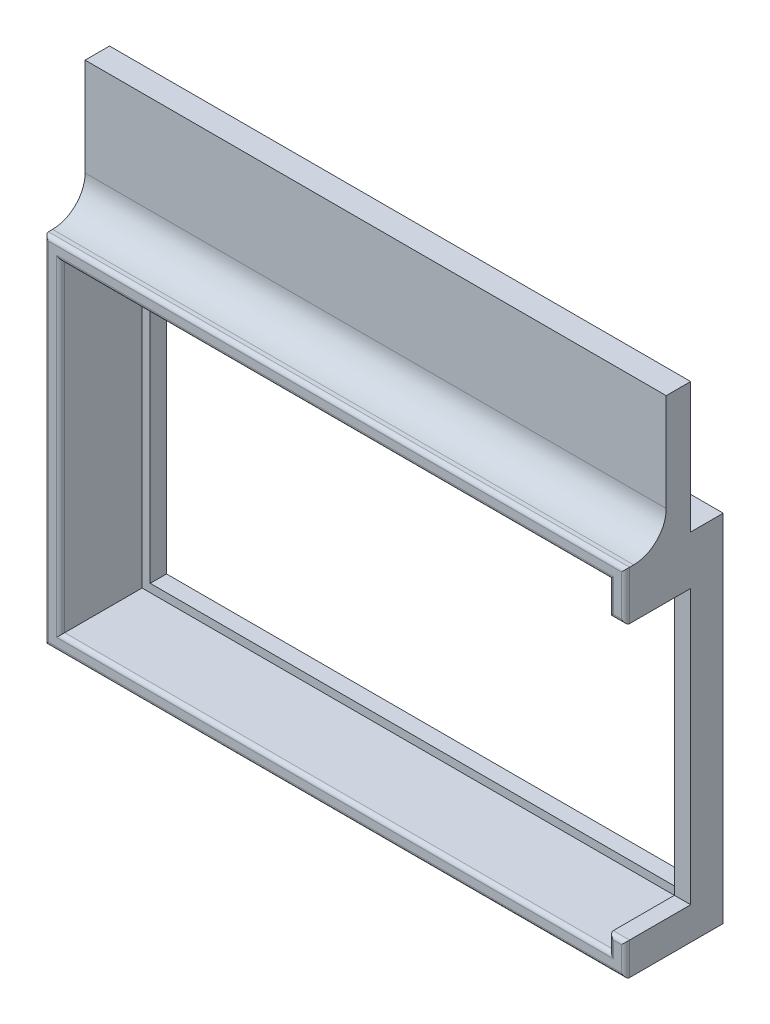
ISO-10303-21;
HEADER;
FILE_DESCRIPTION(('STEP AP214'),'2;1');
FILE_NAME('part.step','',(''),(''),'','','');
FILE_SCHEMA(('AUTOMOTIVE_DESIGN { 1 0 10303 214 1 1 1 1 }'));
ENDSEC;
DATA;
#1=APPLICATION_CONTEXT('core data for automotive mechanical design processes');
#2=APPLICATION_PROTOCOL_DEFINITION('international standard','automotive_design',2000,#1);
#3=PRODUCT_CONTEXT('',#1,'mechanical');
#4=PRODUCT('Part','Part','',(#3));
#5=PRODUCT_RELATED_PRODUCT_CATEGORY('part','',(#4));
#6=PRODUCT_DEFINITION_FORMATION('','',#4);
#7=PRODUCT_DEFINITION_CONTEXT('part definition',#1,'design');
#8=PRODUCT_DEFINITION('design','',#6,#7);
#9=PRODUCT_DEFINITION_SHAPE('','',#8);
#10=(LENGTH_UNIT() NAMED_UNIT(*) SI_UNIT(.MILLI.,.METRE.));
#11=(NAMED_UNIT(*) PLANE_ANGLE_UNIT() SI_UNIT($,.RADIAN.));
#12=(NAMED_UNIT(*) SI_UNIT($,.STERADIAN.) SOLID_ANGLE_UNIT());
#13=UNCERTAINTY_MEASURE_WITH_UNIT(LENGTH_MEASURE(1.E-05),#10,'distance_accuracy_value','');
#14=(GEOMETRIC_REPRESENTATION_CONTEXT(3) GLOBAL_UNCERTAINTY_ASSIGNED_CONTEXT((#13)) GLOBAL_UNIT_ASSIGNED_CONTEXT((#10,
#11,#12)) REPRESENTATION_CONTEXT('',''));
#15=CARTESIAN_POINT('',(0.,0.,0.));
#16=DIRECTION('',(0.,0.,1.));
#17=DIRECTION('',(1.,0.,0.));
#18=AXIS2_PLACEMENT_3D('',#15,#16,#17);
#19=CARTESIAN_POINT('',(0.,29.82,2.));
#20=DIRECTION('',(0.,1.,0.));
#21=DIRECTION('',(0.,0.,1.));
#22=AXIS2_PLACEMENT_3D('',#19,#20,#21);
#23=PLANE('',#22);
#24=DIRECTION('',(0.,0.,1.));
#25=VECTOR('',#24,1.);
#26=CARTESIAN_POINT('',(0.,29.82,2.));
#27=LINE('',#26,#25);
#28=CARTESIAN_POINT('',(0.,29.82,2.));
#29=VERTEX_POINT('',#28);
#30=CARTESIAN_POINT('',(0.,29.82,3.5));
#31=VERTEX_POINT('',#30);
#32=EDGE_CURVE('E229',#29,#31,#27,.T.);
#33=ORIENTED_EDGE('',*,*,#32,.T.);
#34=DIRECTION('',(-1.,0.,0.));
#35=VECTOR('',#34,1.);
#36=CARTESIAN_POINT('',(0.,29.82,3.5));
#37=LINE('',#36,#35);
#38=CARTESIAN_POINT('',(35.68,29.82,3.5));
#39=VERTEX_POINT('',#38);
#40=EDGE_CURVE('E214',#39,#31,#37,.T.);
#41=ORIENTED_EDGE('',*,*,#40,.F.);
#42=DIRECTION('',(0.,0.,1.));
#43=VECTOR('',#42,1.);
#44=CARTESIAN_POINT('',(35.68,29.82,2.));
#45=LINE('',#44,#43);
#46=CARTESIAN_POINT('',(35.68,29.82,2.));
#47=VERTEX_POINT('',#46);
#48=EDGE_CURVE('E238',#47,#39,#45,.T.);
#49=ORIENTED_EDGE('',*,*,#48,.F.);
#50=DIRECTION('',(-1.,0.,0.));
#51=VECTOR('',#50,1.);
#52=CARTESIAN_POINT('',(0.,29.82,2.));
#53=LINE('',#52,#51);
#54=EDGE_CURVE('E236',#47,#29,#53,.T.);
#55=ORIENTED_EDGE('',*,*,#54,.T.);
#56=EDGE_LOOP('',(#33,#41,#49,#55));
#57=FACE_BOUND('',#56,.T.);
#58=ADVANCED_FACE('F33',(#57),#23,.T.);
#59=CARTESIAN_POINT('',(0.,0.,1.));
#60=DIRECTION('',(0.,0.,-1.));
#61=DIRECTION('',(-1.,0.,0.));
#62=AXIS2_PLACEMENT_3D('',#59,#60,#61);
#63=PLANE('',#62);
#64=DIRECTION('',(0.,-1.,0.));
#65=VECTOR('',#64,1.);
#66=CARTESIAN_POINT('',(1.,1.,1.));
#67=LINE('',#66,#65);
#68=CARTESIAN_POINT('',(1.,20.82,1.));
#69=VERTEX_POINT('',#68);
#70=CARTESIAN_POINT('',(1.,1.,1.));
#71=VERTEX_POINT('',#70);
#72=EDGE_CURVE('E282',#69,#71,#67,.T.);
#73=ORIENTED_EDGE('',*,*,#72,.T.);
#74=DIRECTION('',(1.,0.,0.));
#75=VECTOR('',#74,1.);
#76=CARTESIAN_POINT('',(1.,1.,1.));
#77=LINE('',#76,#75);
#78=CARTESIAN_POINT('',(34.68,1.,1.));
#79=VERTEX_POINT('',#78);
#80=EDGE_CURVE('E291',#71,#79,#77,.T.);
#81=ORIENTED_EDGE('',*,*,#80,.T.);
#82=DIRECTION('',(0.,1.,0.));
#83=VECTOR('',#82,1.);
#84=CARTESIAN_POINT('',(34.68,1.,1.));
#85=LINE('',#84,#83);
#86=CARTESIAN_POINT('',(34.68,20.82,1.));
#87=VERTEX_POINT('',#86);
#88=EDGE_CURVE('E294',#79,#87,#85,.T.);
#89=ORIENTED_EDGE('',*,*,#88,.T.);
#90=DIRECTION('',(-1.,0.,0.));
#91=VECTOR('',#90,1.);
#92=CARTESIAN_POINT('',(1.,20.82,1.));
#93=LINE('',#92,#91);
#94=EDGE_CURVE('E297',#87,#69,#93,.T.);
#95=ORIENTED_EDGE('',*,*,#94,.T.);
#96=EDGE_LOOP('',(#73,#81,#89,#95));
#97=FACE_BOUND('',#96,.T.);
#98=DIRECTION('',(0.,-1.,0.));
#99=VECTOR('',#98,1.);
#100=CARTESIAN_POINT('',(1.5,1.5,1.));
#101=LINE('',#100,#99);
#102=CARTESIAN_POINT('',(1.5,20.32,1.));
#103=VERTEX_POINT('',#102);
#104=CARTESIAN_POINT('',(1.5,1.5,1.));
#105=VERTEX_POINT('',#104);
#106=EDGE_CURVE('E254',#103,#105,#101,.T.);
#107=ORIENTED_EDGE('',*,*,#106,.F.);
#108=DIRECTION('',(-1.,0.,0.));
#109=VECTOR('',#108,1.);
#110=CARTESIAN_POINT('',(1.5,20.32,1.));
#111=LINE('',#110,#109);
#112=CARTESIAN_POINT('',(34.18,20.32,1.));
#113=VERTEX_POINT('',#112);
#114=EDGE_CURVE('E261',#113,#103,#111,.T.);
#115=ORIENTED_EDGE('',*,*,#114,.F.);
#116=DIRECTION('',(0.,1.,0.));
#117=VECTOR('',#116,1.);
#118=CARTESIAN_POINT('',(34.18,1.5,1.));
#119=LINE('',#118,#117);
#120=CARTESIAN_POINT('',(34.18,1.5,1.));
#121=VERTEX_POINT('',#120);
#122=EDGE_CURVE('E276',#121,#113,#119,.T.);
#123=ORIENTED_EDGE('',*,*,#122,.F.);
#124=DIRECTION('',(1.,0.,0.));
#125=VECTOR('',#124,1.);
#126=CARTESIAN_POINT('',(1.5,1.5,1.));
#127=LINE('',#126,#125);
#128=EDGE_CURVE('E273',#105,#121,#127,.T.);
#129=ORIENTED_EDGE('',*,*,#128,.F.);
#130=EDGE_LOOP('',(#107,#115,#123,#129));
#131=FACE_BOUND('',#130,.T.);
#132=ADVANCED_FACE('F521',(#97,#131),#63,.F.);
#133=CARTESIAN_POINT('',(0.,0.,6.));
#134=DIRECTION('',(1.,0.,0.));
#135=DIRECTION('',(0.,0.,-1.));
#136=AXIS2_PLACEMENT_3D('',#133,#134,#135);
#137=PLANE('',#136);
#138=DIRECTION('',(0.,0.,-1.));
#139=VECTOR('',#138,1.);
#140=CARTESIAN_POINT('',(0.,0.,6.));
#141=LINE('',#140,#139);
#142=CARTESIAN_POINT('',(0.,0.,5.75));
#143=VERTEX_POINT('',#142);
#144=CARTESIAN_POINT('',(0.,0.,0.));
#145=VERTEX_POINT('',#144);
#146=EDGE_CURVE('E330',#143,#145,#141,.T.);
#147=ORIENTED_EDGE('',*,*,#146,.F.);
#148=DIRECTION('',(0.,-1.,0.));
#149=VECTOR('',#148,1.);
#150=CARTESIAN_POINT('',(0.,0.,5.75));
#151=LINE('',#150,#149);
#152=CARTESIAN_POINT('',(0.,21.82,5.75));
#153=VERTEX_POINT('',#152);
#154=EDGE_CURVE('E42',#143,#153,#151,.F.);
#155=ORIENTED_EDGE('',*,*,#154,.T.);
#156=DIRECTION('',(0.,0.,1.));
#157=VECTOR('',#156,1.);
#158=CARTESIAN_POINT('',(0.,21.82,3.5));
#159=LINE('',#158,#157);
#160=CARTESIAN_POINT('',(0.,21.82,5.5));
#161=VERTEX_POINT('',#160);
#162=EDGE_CURVE('E225',#161,#153,#159,.T.);
#163=ORIENTED_EDGE('',*,*,#162,.F.);
#164=CARTESIAN_POINT('',(0.,23.82,5.5));
#165=DIRECTION('',(1.,0.,0.));
#166=DIRECTION('',(0.,0.,-1.));
#167=AXIS2_PLACEMENT_3D('',#164,#165,#166);
#168=CIRCLE('',#167,2.);
#169=CARTESIAN_POINT('',(0.,23.82,3.5));
#170=VERTEX_POINT('',#169);
#171=EDGE_CURVE('E232',#161,#170,#168,.T.);
#172=ORIENTED_EDGE('',*,*,#171,.T.);
#173=DIRECTION('',(0.,-1.,0.));
#174=VECTOR('',#173,1.);
#175=CARTESIAN_POINT('',(0.,29.82,3.5));
#176=LINE('',#175,#174);
#177=EDGE_CURVE('E218',#31,#170,#176,.T.);
#178=ORIENTED_EDGE('',*,*,#177,.F.);
#179=ORIENTED_EDGE('',*,*,#32,.F.);
#180=DIRECTION('',(0.,-1.,0.));
#181=VECTOR('',#180,1.);
#182=CARTESIAN_POINT('',(0.,21.82,2.));
#183=LINE('',#182,#181);
#184=CARTESIAN_POINT('',(0.,21.82,2.));
#185=VERTEX_POINT('',#184);
#186=EDGE_CURVE('E491',#29,#185,#183,.T.);
#187=ORIENTED_EDGE('',*,*,#186,.T.);
#188=DIRECTION('',(0.,0.,-1.));
#189=VECTOR('',#188,1.);
#190=CARTESIAN_POINT('',(0.,21.82,6.));
#191=LINE('',#190,#189);
#192=CARTESIAN_POINT('',(0.,21.82,0.));
#193=VERTEX_POINT('',#192);
#194=EDGE_CURVE('E324',#185,#193,#191,.T.);
#195=ORIENTED_EDGE('',*,*,#194,.T.);
#196=DIRECTION('',(0.,-1.,0.));
#197=VECTOR('',#196,1.);
#198=CARTESIAN_POINT('',(0.,0.,0.));
#199=LINE('',#198,#197);
#200=EDGE_CURVE('E304',#193,#145,#199,.T.);
#201=ORIENTED_EDGE('',*,*,#200,.T.);
#202=EDGE_LOOP('',(#147,#155,#163,#172,#178,#179,#187,#195,#201));
#203=FACE_BOUND('',#202,.T.);
#204=ADVANCED_FACE('F227',(#203),#137,.F.);
#205=CARTESIAN_POINT('',(0.,0.,6.));
#206=DIRECTION('',(0.,1.,0.));
#207=DIRECTION('',(0.,0.,1.));
#208=AXIS2_PLACEMENT_3D('',#205,#206,#207);
#209=PLANE('',#208);
#210=DIRECTION('',(0.,0.,-1.));
#211=VECTOR('',#210,1.);
#212=CARTESIAN_POINT('',(35.68,0.,6.));
#213=LINE('',#212,#211);
#214=CARTESIAN_POINT('',(35.68,0.,5.75));
#215=VERTEX_POINT('',#214);
#216=CARTESIAN_POINT('',(35.68,0.,0.));
#217=VERTEX_POINT('',#216);
#218=EDGE_CURVE('E328',#215,#217,#213,.T.);
#219=ORIENTED_EDGE('',*,*,#218,.F.);
#220=DIRECTION('',(1.,0.,0.));
#221=VECTOR('',#220,1.);
#222=CARTESIAN_POINT('',(0.,0.,5.75));
#223=LINE('',#222,#221);
#224=EDGE_CURVE('E57',#215,#143,#223,.F.);
#225=ORIENTED_EDGE('',*,*,#224,.T.);
#226=ORIENTED_EDGE('',*,*,#146,.T.);
#227=DIRECTION('',(1.,0.,0.));
#228=VECTOR('',#227,1.);
#229=CARTESIAN_POINT('',(0.,0.,0.));
#230=LINE('',#229,#228);
#231=EDGE_CURVE('E315',#145,#217,#230,.T.);
#232=ORIENTED_EDGE('',*,*,#231,.T.);
#233=EDGE_LOOP('',(#219,#225,#226,#232));
#234=FACE_BOUND('',#233,.T.);
#235=ADVANCED_FACE('F513',(#234),#209,.F.);
#236=CARTESIAN_POINT('',(35.68,0.,6.));
#237=DIRECTION('',(-1.,0.,0.));
#238=DIRECTION('',(0.,0.,1.));
#239=AXIS2_PLACEMENT_3D('',#236,#237,#238);
#240=PLANE('',#239);
#241=DIRECTION('',(0.,0.,-1.));
#242=VECTOR('',#241,1.);
#243=CARTESIAN_POINT('',(35.68,2.,6.));
#244=LINE('',#243,#242);
#245=CARTESIAN_POINT('',(35.68,2.,5.75));
#246=VERTEX_POINT('',#245);
#247=CARTESIAN_POINT('',(35.68,2.,2.));
#248=VERTEX_POINT('',#247);
#249=EDGE_CURVE('E237',#246,#248,#244,.T.);
#250=ORIENTED_EDGE('',*,*,#249,.F.);
#251=DIRECTION('',(0.,1.,0.));
#252=VECTOR('',#251,1.);
#253=CARTESIAN_POINT('',(35.68,0.,5.75));
#254=LINE('',#253,#252);
#255=EDGE_CURVE('E389',#246,#215,#254,.F.);
#256=ORIENTED_EDGE('',*,*,#255,.T.);
#257=ORIENTED_EDGE('',*,*,#218,.T.);
#258=DIRECTION('',(0.,1.,0.));
#259=VECTOR('',#258,1.);
#260=CARTESIAN_POINT('',(35.68,0.,0.));
#261=LINE('',#260,#259);
#262=CARTESIAN_POINT('',(35.68,21.82,0.));
#263=VERTEX_POINT('',#262);
#264=EDGE_CURVE('E318',#217,#263,#261,.T.);
#265=ORIENTED_EDGE('',*,*,#264,.T.);
#266=DIRECTION('',(0.,0.,-1.));
#267=VECTOR('',#266,1.);
#268=CARTESIAN_POINT('',(35.68,21.82,6.));
#269=LINE('',#268,#267);
#270=CARTESIAN_POINT('',(35.68,21.82,2.));
#271=VERTEX_POINT('',#270);
#272=EDGE_CURVE('E326',#271,#263,#269,.T.);
#273=ORIENTED_EDGE('',*,*,#272,.F.);
#274=DIRECTION('',(0.,1.,0.));
#275=VECTOR('',#274,1.);
#276=CARTESIAN_POINT('',(35.68,21.82,2.));
#277=LINE('',#276,#275);
#278=EDGE_CURVE('E499',#271,#47,#277,.T.);
#279=ORIENTED_EDGE('',*,*,#278,.T.);
#280=ORIENTED_EDGE('',*,*,#48,.T.);
#281=DIRECTION('',(0.,1.,0.));
#282=VECTOR('',#281,1.);
#283=CARTESIAN_POINT('',(35.68,29.82,3.5));
#284=LINE('',#283,#282);
#285=CARTESIAN_POINT('',(35.68,23.82,3.5));
#286=VERTEX_POINT('',#285);
#287=EDGE_CURVE('E221',#286,#39,#284,.T.);
#288=ORIENTED_EDGE('',*,*,#287,.F.);
#289=CARTESIAN_POINT('',(35.68,23.82,5.5));
#290=DIRECTION('',(-1.,0.,0.));
#291=DIRECTION('',(0.,0.,1.));
#292=AXIS2_PLACEMENT_3D('',#289,#290,#291);
#293=CIRCLE('',#292,2.);
#294=CARTESIAN_POINT('',(35.68,21.82,5.5));
#295=VERTEX_POINT('',#294);
#296=EDGE_CURVE('E344',#286,#295,#293,.T.);
#297=ORIENTED_EDGE('',*,*,#296,.T.);
#298=DIRECTION('',(0.,0.,1.));
#299=VECTOR('',#298,1.);
#300=CARTESIAN_POINT('',(35.68,21.82,3.5));
#301=LINE('',#300,#299);
#302=CARTESIAN_POINT('',(35.68,21.82,5.75));
#303=VERTEX_POINT('',#302);
#304=EDGE_CURVE('E489',#295,#303,#301,.T.);
#305=ORIENTED_EDGE('',*,*,#304,.T.);
#306=DIRECTION('',(0.,1.,0.));
#307=VECTOR('',#306,1.);
#308=CARTESIAN_POINT('',(35.68,0.,5.75));
#309=LINE('',#308,#307);
#310=CARTESIAN_POINT('',(35.68,18.82,5.75));
#311=VERTEX_POINT('',#310);
#312=EDGE_CURVE('E387',#303,#311,#309,.F.);
#313=ORIENTED_EDGE('',*,*,#312,.T.);
#314=DIRECTION('',(0.,0.,1.));
#315=VECTOR('',#314,1.);
#316=CARTESIAN_POINT('',(35.68,18.82,6.));
#317=LINE('',#316,#315);
#318=CARTESIAN_POINT('',(35.68,18.82,2.));
#319=VERTEX_POINT('',#318);
#320=EDGE_CURVE('E248',#319,#311,#317,.T.);
#321=ORIENTED_EDGE('',*,*,#320,.F.);
#322=DIRECTION('',(0.,1.,0.));
#323=VECTOR('',#322,1.);
#324=CARTESIAN_POINT('',(35.68,18.82,2.));
#325=LINE('',#324,#323);
#326=EDGE_CURVE('E240',#248,#319,#325,.T.);
#327=ORIENTED_EDGE('',*,*,#326,.F.);
#328=EDGE_LOOP('',(#250,#256,#257,#265,#273,#279,#280,#288,#297,#305,#313,#321,#327));
#329=FACE_BOUND('',#328,.T.);
#330=ADVANCED_FACE('F443',(#329),#240,.F.);
#331=CARTESIAN_POINT('',(0.,21.82,6.));
#332=DIRECTION('',(0.,-1.,0.));
#333=DIRECTION('',(0.,0.,-1.));
#334=AXIS2_PLACEMENT_3D('',#331,#332,#333);
#335=PLANE('',#334);
#336=ORIENTED_EDGE('',*,*,#194,.F.);
#337=DIRECTION('',(1.,0.,0.));
#338=VECTOR('',#337,1.);
#339=CARTESIAN_POINT('',(0.,21.82,2.));
#340=LINE('',#339,#338);
#341=EDGE_CURVE('E493',#185,#271,#340,.T.);
#342=ORIENTED_EDGE('',*,*,#341,.T.);
#343=ORIENTED_EDGE('',*,*,#272,.T.);
#344=DIRECTION('',(-1.,0.,0.));
#345=VECTOR('',#344,1.);
#346=CARTESIAN_POINT('',(0.,21.82,0.));
#347=LINE('',#346,#345);
#348=EDGE_CURVE('E321',#263,#193,#347,.T.);
#349=ORIENTED_EDGE('',*,*,#348,.T.);
#350=EDGE_LOOP('',(#336,#342,#343,#349));
#351=FACE_BOUND('',#350,.T.);
#352=ADVANCED_FACE('F506',(#351),#335,.F.);
#353=CARTESIAN_POINT('',(0.,0.,6.));
#354=DIRECTION('',(0.,0.,-1.));
#355=DIRECTION('',(-1.,0.,0.));
#356=AXIS2_PLACEMENT_3D('',#353,#354,#355);
#357=PLANE('',#356);
#358=DIRECTION('',(0.,1.,0.));
#359=VECTOR('',#358,1.);
#360=CARTESIAN_POINT('',(34.93,0.,6.));
#361=LINE('',#360,#359);
#362=CARTESIAN_POINT('',(34.93,21.07,6.));
#363=VERTEX_POINT('',#362);
#364=CARTESIAN_POINT('',(34.93,19.07,6.));
#365=VERTEX_POINT('',#364);
#366=EDGE_CURVE('E367',#363,#365,#361,.F.);
#367=ORIENTED_EDGE('',*,*,#366,.T.);
#368=DIRECTION('',(1.,0.,0.));
#369=VECTOR('',#368,1.);
#370=CARTESIAN_POINT('',(0.,19.07,6.));
#371=LINE('',#370,#369);
#372=CARTESIAN_POINT('',(35.43,19.07,6.));
#373=VERTEX_POINT('',#372);
#374=EDGE_CURVE('E369',#365,#373,#371,.T.);
#375=ORIENTED_EDGE('',*,*,#374,.T.);
#376=DIRECTION('',(0.,1.,0.));
#377=VECTOR('',#376,1.);
#378=CARTESIAN_POINT('',(35.43,0.,6.));
#379=LINE('',#378,#377);
#380=CARTESIAN_POINT('',(35.43,21.57,6.));
#381=VERTEX_POINT('',#380);
#382=EDGE_CURVE('E347',#373,#381,#379,.T.);
#383=ORIENTED_EDGE('',*,*,#382,.T.);
#384=DIRECTION('',(1.,0.,0.));
#385=VECTOR('',#384,1.);
#386=CARTESIAN_POINT('',(0.,21.57,6.));
#387=LINE('',#386,#385);
#388=CARTESIAN_POINT('',(0.25,21.57,6.));
#389=VERTEX_POINT('',#388);
#390=EDGE_CURVE('E349',#381,#389,#387,.F.);
#391=ORIENTED_EDGE('',*,*,#390,.T.);
#392=DIRECTION('',(0.,-1.,0.));
#393=VECTOR('',#392,1.);
#394=CARTESIAN_POINT('',(0.25,0.,6.));
#395=LINE('',#394,#393);
#396=CARTESIAN_POINT('',(0.25,0.25,6.));
#397=VERTEX_POINT('',#396);
#398=EDGE_CURVE('E351',#389,#397,#395,.T.);
#399=ORIENTED_EDGE('',*,*,#398,.T.);
#400=DIRECTION('',(1.,0.,0.));
#401=VECTOR('',#400,1.);
#402=CARTESIAN_POINT('',(0.,0.25,6.));
#403=LINE('',#402,#401);
#404=CARTESIAN_POINT('',(35.43,0.25,6.));
#405=VERTEX_POINT('',#404);
#406=EDGE_CURVE('E353',#397,#405,#403,.T.);
#407=ORIENTED_EDGE('',*,*,#406,.T.);
#408=DIRECTION('',(0.,1.,0.));
#409=VECTOR('',#408,1.);
#410=CARTESIAN_POINT('',(35.43,0.,6.));
#411=LINE('',#410,#409);
#412=CARTESIAN_POINT('',(35.43,1.75,6.));
#413=VERTEX_POINT('',#412);
#414=EDGE_CURVE('E355',#405,#413,#411,.T.);
#415=ORIENTED_EDGE('',*,*,#414,.T.);
#416=DIRECTION('',(1.,0.,0.));
#417=VECTOR('',#416,1.);
#418=CARTESIAN_POINT('',(0.,1.75,6.));
#419=LINE('',#418,#417);
#420=CARTESIAN_POINT('',(34.93,1.75,6.));
#421=VERTEX_POINT('',#420);
#422=EDGE_CURVE('E357',#413,#421,#419,.F.);
#423=ORIENTED_EDGE('',*,*,#422,.T.);
#424=DIRECTION('',(0.,1.,0.));
#425=VECTOR('',#424,1.);
#426=CARTESIAN_POINT('',(34.93,0.,6.));
#427=LINE('',#426,#425);
#428=CARTESIAN_POINT('',(34.93,0.75,6.));
#429=VERTEX_POINT('',#428);
#430=EDGE_CURVE('E359',#421,#429,#427,.F.);
#431=ORIENTED_EDGE('',*,*,#430,.T.);
#432=DIRECTION('',(1.,0.,0.));
#433=VECTOR('',#432,1.);
#434=CARTESIAN_POINT('',(0.,0.75,6.));
#435=LINE('',#434,#433);
#436=CARTESIAN_POINT('',(0.75,0.75,6.));
#437=VERTEX_POINT('',#436);
#438=EDGE_CURVE('E361',#429,#437,#435,.F.);
#439=ORIENTED_EDGE('',*,*,#438,.T.);
#440=DIRECTION('',(0.,-1.,0.));
#441=VECTOR('',#440,1.);
#442=CARTESIAN_POINT('',(0.75,0.,6.));
#443=LINE('',#442,#441);
#444=CARTESIAN_POINT('',(0.75,21.07,6.));
#445=VERTEX_POINT('',#444);
#446=EDGE_CURVE('E363',#437,#445,#443,.F.);
#447=ORIENTED_EDGE('',*,*,#446,.T.);
#448=DIRECTION('',(-1.,0.,0.));
#449=VECTOR('',#448,1.);
#450=CARTESIAN_POINT('',(0.,21.07,6.));
#451=LINE('',#450,#449);
#452=EDGE_CURVE('E365',#445,#363,#451,.F.);
#453=ORIENTED_EDGE('',*,*,#452,.T.);
#454=EDGE_LOOP('',(#367,#375,#383,#391,#399,#407,#415,#423,#431,#439,#447,#453));
#455=FACE_BOUND('',#454,.T.);
#456=ADVANCED_FACE('F467',(#455),#357,.F.);
#457=CARTESIAN_POINT('',(0.,0.,0.));
#458=DIRECTION('',(0.,0.,-1.));
#459=DIRECTION('',(-1.,0.,0.));
#460=AXIS2_PLACEMENT_3D('',#457,#458,#459);
#461=PLANE('',#460);
#462=DIRECTION('',(0.,-1.,0.));
#463=VECTOR('',#462,1.);
#464=CARTESIAN_POINT('',(1.5,1.5,0.));
#465=LINE('',#464,#463);
#466=CARTESIAN_POINT('',(1.5,20.32,0.));
#467=VERTEX_POINT('',#466);
#468=CARTESIAN_POINT('',(1.5,1.5,0.));
#469=VERTEX_POINT('',#468);
#470=EDGE_CURVE('E257',#467,#469,#465,.T.);
#471=ORIENTED_EDGE('',*,*,#470,.T.);
#472=DIRECTION('',(1.,0.,0.));
#473=VECTOR('',#472,1.);
#474=CARTESIAN_POINT('',(1.5,1.5,0.));
#475=LINE('',#474,#473);
#476=CARTESIAN_POINT('',(34.18,1.5,0.));
#477=VERTEX_POINT('',#476);
#478=EDGE_CURVE('E260',#469,#477,#475,.T.);
#479=ORIENTED_EDGE('',*,*,#478,.T.);
#480=DIRECTION('',(0.,1.,0.));
#481=VECTOR('',#480,1.);
#482=CARTESIAN_POINT('',(34.18,1.5,0.));
#483=LINE('',#482,#481);
#484=CARTESIAN_POINT('',(34.18,20.32,0.));
#485=VERTEX_POINT('',#484);
#486=EDGE_CURVE('E264',#477,#485,#483,.T.);
#487=ORIENTED_EDGE('',*,*,#486,.T.);
#488=DIRECTION('',(-1.,0.,0.));
#489=VECTOR('',#488,1.);
#490=CARTESIAN_POINT('',(1.5,20.32,0.));
#491=LINE('',#490,#489);
#492=EDGE_CURVE('E267',#485,#467,#491,.T.);
#493=ORIENTED_EDGE('',*,*,#492,.T.);
#494=EDGE_LOOP('',(#471,#479,#487,#493));
#495=FACE_BOUND('',#494,.T.);
#496=ORIENTED_EDGE('',*,*,#200,.F.);
#497=ORIENTED_EDGE('',*,*,#348,.F.);
#498=ORIENTED_EDGE('',*,*,#264,.F.);
#499=ORIENTED_EDGE('',*,*,#231,.F.);
#500=EDGE_LOOP('',(#496,#497,#498,#499));
#501=FACE_BOUND('',#500,.T.);
#502=ADVANCED_FACE('F512',(#495,#501),#461,.T.);
#503=CARTESIAN_POINT('',(1.,1.,1.));
#504=DIRECTION('',(-1.,0.,0.));
#505=DIRECTION('',(0.,0.,1.));
#506=AXIS2_PLACEMENT_3D('',#503,#504,#505);
#507=PLANE('',#506);
#508=DIRECTION('',(0.,0.,1.));
#509=VECTOR('',#508,1.);
#510=CARTESIAN_POINT('',(1.,20.82,1.));
#511=LINE('',#510,#509);
#512=CARTESIAN_POINT('',(1.,20.82,5.75));
#513=VERTEX_POINT('',#512);
#514=EDGE_CURVE('E301',#69,#513,#511,.T.);
#515=ORIENTED_EDGE('',*,*,#514,.T.);
#516=DIRECTION('',(0.,-1.,0.));
#517=VECTOR('',#516,1.);
#518=CARTESIAN_POINT('',(1.,1.,5.75));
#519=LINE('',#518,#517);
#520=CARTESIAN_POINT('',(1.,1.,5.75));
#521=VERTEX_POINT('',#520);
#522=EDGE_CURVE('E381',#513,#521,#519,.T.);
#523=ORIENTED_EDGE('',*,*,#522,.T.);
#524=DIRECTION('',(0.,0.,1.));
#525=VECTOR('',#524,1.);
#526=CARTESIAN_POINT('',(1.,1.,1.));
#527=LINE('',#526,#525);
#528=EDGE_CURVE('E300',#71,#521,#527,.T.);
#529=ORIENTED_EDGE('',*,*,#528,.F.);
#530=ORIENTED_EDGE('',*,*,#72,.F.);
#531=EDGE_LOOP('',(#515,#523,#529,#530));
#532=FACE_BOUND('',#531,.T.);
#533=ADVANCED_FACE('F560',(#532),#507,.F.);
#534=CARTESIAN_POINT('',(1.,20.82,1.));
#535=DIRECTION('',(0.,1.,0.));
#536=DIRECTION('',(0.,0.,1.));
#537=AXIS2_PLACEMENT_3D('',#534,#535,#536);
#538=PLANE('',#537);
#539=DIRECTION('',(0.,0.,1.));
#540=VECTOR('',#539,1.);
#541=CARTESIAN_POINT('',(34.68,20.82,1.));
#542=LINE('',#541,#540);
#543=CARTESIAN_POINT('',(34.68,20.82,5.75));
#544=VERTEX_POINT('',#543);
#545=EDGE_CURVE('E305',#87,#544,#542,.T.);
#546=ORIENTED_EDGE('',*,*,#545,.T.);
#547=DIRECTION('',(-1.,0.,0.));
#548=VECTOR('',#547,1.);
#549=CARTESIAN_POINT('',(1.,20.82,5.75));
#550=LINE('',#549,#548);
#551=EDGE_CURVE('E379',#544,#513,#550,.T.);
#552=ORIENTED_EDGE('',*,*,#551,.T.);
#553=ORIENTED_EDGE('',*,*,#514,.F.);
#554=ORIENTED_EDGE('',*,*,#94,.F.);
#555=EDGE_LOOP('',(#546,#552,#553,#554));
#556=FACE_BOUND('',#555,.T.);
#557=ADVANCED_FACE('F557',(#556),#538,.F.);
#558=CARTESIAN_POINT('',(34.68,1.,1.));
#559=DIRECTION('',(1.,0.,0.));
#560=DIRECTION('',(0.,0.,-1.));
#561=AXIS2_PLACEMENT_3D('',#558,#559,#560);
#562=PLANE('',#561);
#563=DIRECTION('',(0.,0.,1.));
#564=VECTOR('',#563,1.);
#565=CARTESIAN_POINT('',(34.68,18.82,1.));
#566=LINE('',#565,#564);
#567=CARTESIAN_POINT('',(34.68,18.82,2.));
#568=VERTEX_POINT('',#567);
#569=CARTESIAN_POINT('',(34.68,18.82,5.75));
#570=VERTEX_POINT('',#569);
#571=EDGE_CURVE('E337',#568,#570,#566,.T.);
#572=ORIENTED_EDGE('',*,*,#571,.T.);
#573=DIRECTION('',(0.,1.,0.));
#574=VECTOR('',#573,1.);
#575=CARTESIAN_POINT('',(34.68,1.,5.75));
#576=LINE('',#575,#574);
#577=EDGE_CURVE('E377',#570,#544,#576,.T.);
#578=ORIENTED_EDGE('',*,*,#577,.T.);
#579=ORIENTED_EDGE('',*,*,#545,.F.);
#580=ORIENTED_EDGE('',*,*,#88,.F.);
#581=DIRECTION('',(0.,0.,1.));
#582=VECTOR('',#581,1.);
#583=CARTESIAN_POINT('',(34.68,1.,1.));
#584=LINE('',#583,#582);
#585=CARTESIAN_POINT('',(34.68,1.,5.75));
#586=VERTEX_POINT('',#585);
#587=EDGE_CURVE('E308',#79,#586,#584,.T.);
#588=ORIENTED_EDGE('',*,*,#587,.T.);
#589=DIRECTION('',(0.,1.,0.));
#590=VECTOR('',#589,1.);
#591=CARTESIAN_POINT('',(34.68,1.,5.75));
#592=LINE('',#591,#590);
#593=CARTESIAN_POINT('',(34.68,2.,5.75));
#594=VERTEX_POINT('',#593);
#595=EDGE_CURVE('E375',#586,#594,#592,.T.);
#596=ORIENTED_EDGE('',*,*,#595,.T.);
#597=DIRECTION('',(0.,0.,-1.));
#598=VECTOR('',#597,1.);
#599=CARTESIAN_POINT('',(34.68,2.,1.));
#600=LINE('',#599,#598);
#601=CARTESIAN_POINT('',(34.68,2.,2.));
#602=VERTEX_POINT('',#601);
#603=EDGE_CURVE('E332',#594,#602,#600,.T.);
#604=ORIENTED_EDGE('',*,*,#603,.T.);
#605=DIRECTION('',(0.,1.,0.));
#606=VECTOR('',#605,1.);
#607=CARTESIAN_POINT('',(34.68,1.,2.));
#608=LINE('',#607,#606);
#609=EDGE_CURVE('E334',#602,#568,#608,.T.);
#610=ORIENTED_EDGE('',*,*,#609,.T.);
#611=EDGE_LOOP('',(#572,#578,#579,#580,#588,#596,#604,#610));
#612=FACE_BOUND('',#611,.T.);
#613=ADVANCED_FACE('F450',(#612),#562,.F.);
#614=CARTESIAN_POINT('',(1.,1.,1.));
#615=DIRECTION('',(0.,-1.,0.));
#616=DIRECTION('',(0.,0.,-1.));
#617=AXIS2_PLACEMENT_3D('',#614,#615,#616);
#618=PLANE('',#617);
#619=ORIENTED_EDGE('',*,*,#528,.T.);
#620=DIRECTION('',(1.,0.,0.));
#621=VECTOR('',#620,1.);
#622=CARTESIAN_POINT('',(1.,1.,5.75));
#623=LINE('',#622,#621);
#624=EDGE_CURVE('E383',#521,#586,#623,.T.);
#625=ORIENTED_EDGE('',*,*,#624,.T.);
#626=ORIENTED_EDGE('',*,*,#587,.F.);
#627=ORIENTED_EDGE('',*,*,#80,.F.);
#628=EDGE_LOOP('',(#619,#625,#626,#627));
#629=FACE_BOUND('',#628,.T.);
#630=ADVANCED_FACE('F454',(#629),#618,.F.);
#631=CARTESIAN_POINT('',(1.5,1.5,0.));
#632=DIRECTION('',(-1.,0.,0.));
#633=DIRECTION('',(0.,0.,1.));
#634=AXIS2_PLACEMENT_3D('',#631,#632,#633);
#635=PLANE('',#634);
#636=ORIENTED_EDGE('',*,*,#106,.T.);
#637=DIRECTION('',(0.,0.,1.));
#638=VECTOR('',#637,1.);
#639=CARTESIAN_POINT('',(1.5,1.5,0.));
#640=LINE('',#639,#638);
#641=EDGE_CURVE('E270',#469,#105,#640,.T.);
#642=ORIENTED_EDGE('',*,*,#641,.F.);
#643=ORIENTED_EDGE('',*,*,#470,.F.);
#644=DIRECTION('',(0.,0.,1.));
#645=VECTOR('',#644,1.);
#646=CARTESIAN_POINT('',(1.5,20.32,0.));
#647=LINE('',#646,#645);
#648=EDGE_CURVE('E280',#467,#103,#647,.T.);
#649=ORIENTED_EDGE('',*,*,#648,.T.);
#650=EDGE_LOOP('',(#636,#642,#643,#649));
#651=FACE_BOUND('',#650,.T.);
#652=ADVANCED_FACE('F546',(#651),#635,.F.);
#653=CARTESIAN_POINT('',(1.5,20.32,0.));
#654=DIRECTION('',(0.,1.,0.));
#655=DIRECTION('',(0.,0.,1.));
#656=AXIS2_PLACEMENT_3D('',#653,#654,#655);
#657=PLANE('',#656);
#658=ORIENTED_EDGE('',*,*,#114,.T.);
#659=ORIENTED_EDGE('',*,*,#648,.F.);
#660=ORIENTED_EDGE('',*,*,#492,.F.);
#661=DIRECTION('',(0.,0.,1.));
#662=VECTOR('',#661,1.);
#663=CARTESIAN_POINT('',(34.18,20.32,0.));
#664=LINE('',#663,#662);
#665=EDGE_CURVE('E283',#485,#113,#664,.T.);
#666=ORIENTED_EDGE('',*,*,#665,.T.);
#667=EDGE_LOOP('',(#658,#659,#660,#666));
#668=FACE_BOUND('',#667,.T.);
#669=ADVANCED_FACE('F542',(#668),#657,.F.);
#670=CARTESIAN_POINT('',(34.18,1.5,0.));
#671=DIRECTION('',(1.,0.,0.));
#672=DIRECTION('',(0.,0.,-1.));
#673=AXIS2_PLACEMENT_3D('',#670,#671,#672);
#674=PLANE('',#673);
#675=ORIENTED_EDGE('',*,*,#122,.T.);
#676=ORIENTED_EDGE('',*,*,#665,.F.);
#677=ORIENTED_EDGE('',*,*,#486,.F.);
#678=DIRECTION('',(0.,0.,1.));
#679=VECTOR('',#678,1.);
#680=CARTESIAN_POINT('',(34.18,1.5,0.));
#681=LINE('',#680,#679);
#682=EDGE_CURVE('E286',#477,#121,#681,.T.);
#683=ORIENTED_EDGE('',*,*,#682,.T.);
#684=EDGE_LOOP('',(#675,#676,#677,#683));
#685=FACE_BOUND('',#684,.T.);
#686=ADVANCED_FACE('F545',(#685),#674,.F.);
#687=CARTESIAN_POINT('',(1.5,1.5,0.));
#688=DIRECTION('',(0.,-1.,0.));
#689=DIRECTION('',(0.,0.,-1.));
#690=AXIS2_PLACEMENT_3D('',#687,#688,#689);
#691=PLANE('',#690);
#692=ORIENTED_EDGE('',*,*,#128,.T.);
#693=ORIENTED_EDGE('',*,*,#682,.F.);
#694=ORIENTED_EDGE('',*,*,#478,.F.);
#695=ORIENTED_EDGE('',*,*,#641,.T.);
#696=EDGE_LOOP('',(#692,#693,#694,#695));
#697=FACE_BOUND('',#696,.T.);
#698=ADVANCED_FACE('F536',(#697),#691,.F.);
#699=CARTESIAN_POINT('',(30.68,18.82,6.));
#700=DIRECTION('',(0.,1.,0.));
#701=DIRECTION('',(0.,0.,1.));
#702=AXIS2_PLACEMENT_3D('',#699,#700,#701);
#703=PLANE('',#702);
#704=ORIENTED_EDGE('',*,*,#320,.T.);
#705=DIRECTION('',(1.,0.,0.));
#706=VECTOR('',#705,1.);
#707=CARTESIAN_POINT('',(30.68,18.82,5.75));
#708=LINE('',#707,#706);
#709=EDGE_CURVE('E372',#311,#570,#708,.F.);
#710=ORIENTED_EDGE('',*,*,#709,.T.);
#711=ORIENTED_EDGE('',*,*,#571,.F.);
#712=DIRECTION('',(1.,0.,0.));
#713=VECTOR('',#712,1.);
#714=CARTESIAN_POINT('',(30.68,18.82,2.));
#715=LINE('',#714,#713);
#716=EDGE_CURVE('E252',#568,#319,#715,.T.);
#717=ORIENTED_EDGE('',*,*,#716,.T.);
#718=EDGE_LOOP('',(#704,#710,#711,#717));
#719=FACE_BOUND('',#718,.T.);
#720=ADVANCED_FACE('F533',(#719),#703,.F.);
#721=CARTESIAN_POINT('',(30.68,18.82,2.));
#722=DIRECTION('',(0.,0.,-1.));
#723=DIRECTION('',(0.,1.,0.));
#724=AXIS2_PLACEMENT_3D('',#721,#722,#723);
#725=PLANE('',#724);
#726=DIRECTION('',(1.,0.,0.));
#727=VECTOR('',#726,1.);
#728=CARTESIAN_POINT('',(30.68,2.,2.));
#729=LINE('',#728,#727);
#730=EDGE_CURVE('E251',#602,#248,#729,.T.);
#731=ORIENTED_EDGE('',*,*,#730,.T.);
#732=ORIENTED_EDGE('',*,*,#326,.T.);
#733=ORIENTED_EDGE('',*,*,#716,.F.);
#734=ORIENTED_EDGE('',*,*,#609,.F.);
#735=EDGE_LOOP('',(#731,#732,#733,#734));
#736=FACE_BOUND('',#735,.T.);
#737=ADVANCED_FACE('F447',(#736),#725,.F.);
#738=CARTESIAN_POINT('',(30.68,2.,6.));
#739=DIRECTION('',(0.,-1.,0.));
#740=DIRECTION('',(0.,0.,-1.));
#741=AXIS2_PLACEMENT_3D('',#738,#739,#740);
#742=PLANE('',#741);
#743=ORIENTED_EDGE('',*,*,#603,.F.);
#744=DIRECTION('',(1.,0.,0.));
#745=VECTOR('',#744,1.);
#746=CARTESIAN_POINT('',(30.68,2.,5.75));
#747=LINE('',#746,#745);
#748=EDGE_CURVE('E385',#594,#246,#747,.T.);
#749=ORIENTED_EDGE('',*,*,#748,.T.);
#750=ORIENTED_EDGE('',*,*,#249,.T.);
#751=ORIENTED_EDGE('',*,*,#730,.F.);
#752=EDGE_LOOP('',(#743,#749,#750,#751));
#753=FACE_BOUND('',#752,.T.);
#754=ADVANCED_FACE('F439',(#753),#742,.F.);
#755=CARTESIAN_POINT('',(0.,0.,2.));
#756=DIRECTION('',(0.,0.,-1.));
#757=DIRECTION('',(-1.,0.,0.));
#758=AXIS2_PLACEMENT_3D('',#755,#756,#757);
#759=PLANE('',#758);
#760=ORIENTED_EDGE('',*,*,#186,.F.);
#761=ORIENTED_EDGE('',*,*,#54,.F.);
#762=ORIENTED_EDGE('',*,*,#278,.F.);
#763=ORIENTED_EDGE('',*,*,#341,.F.);
#764=EDGE_LOOP('',(#760,#761,#762,#763));
#765=FACE_BOUND('',#764,.T.);
#766=ADVANCED_FACE('F503',(#765),#759,.T.);
#767=CARTESIAN_POINT('',(0.,21.82,3.5));
#768=DIRECTION('',(0.,-1.,0.));
#769=DIRECTION('',(0.,0.,-1.));
#770=AXIS2_PLACEMENT_3D('',#767,#768,#769);
#771=PLANE('',#770);
#772=ORIENTED_EDGE('',*,*,#162,.T.);
#773=DIRECTION('',(1.,0.,0.));
#774=VECTOR('',#773,1.);
#775=CARTESIAN_POINT('',(0.,21.82,5.75));
#776=LINE('',#775,#774);
#777=EDGE_CURVE('E11',#153,#303,#776,.T.);
#778=ORIENTED_EDGE('',*,*,#777,.T.);
#779=ORIENTED_EDGE('',*,*,#304,.F.);
#780=DIRECTION('',(1.,0.,0.));
#781=VECTOR('',#780,1.);
#782=CARTESIAN_POINT('',(0.,21.82,5.5));
#783=LINE('',#782,#781);
#784=EDGE_CURVE('E342',#295,#161,#783,.F.);
#785=ORIENTED_EDGE('',*,*,#784,.T.);
#786=EDGE_LOOP('',(#772,#778,#779,#785));
#787=FACE_BOUND('',#786,.T.);
#788=ADVANCED_FACE('F488',(#787),#771,.F.);
#789=CARTESIAN_POINT('',(0.,0.,3.5));
#790=DIRECTION('',(0.,0.,1.));
#791=DIRECTION('',(1.,0.,0.));
#792=AXIS2_PLACEMENT_3D('',#789,#790,#791);
#793=PLANE('',#792);
#794=ORIENTED_EDGE('',*,*,#177,.T.);
#795=DIRECTION('',(1.,0.,0.));
#796=VECTOR('',#795,1.);
#797=CARTESIAN_POINT('',(0.,23.82,3.5));
#798=LINE('',#797,#796);
#799=EDGE_CURVE('E340',#170,#286,#798,.T.);
#800=ORIENTED_EDGE('',*,*,#799,.T.);
#801=ORIENTED_EDGE('',*,*,#287,.T.);
#802=ORIENTED_EDGE('',*,*,#40,.T.);
#803=EDGE_LOOP('',(#794,#800,#801,#802));
#804=FACE_BOUND('',#803,.T.);
#805=ADVANCED_FACE('F216',(#804),#793,.T.);
#806=CARTESIAN_POINT('',(0.,23.82,5.5));
#807=DIRECTION('',(1.,0.,0.));
#808=DIRECTION('',(0.,0.,-1.));
#809=AXIS2_PLACEMENT_3D('',#806,#807,#808);
#810=CYLINDRICAL_SURFACE('',#809,2.);
#811=ORIENTED_EDGE('',*,*,#171,.F.);
#812=ORIENTED_EDGE('',*,*,#784,.F.);
#813=ORIENTED_EDGE('',*,*,#296,.F.);
#814=ORIENTED_EDGE('',*,*,#799,.F.);
#815=EDGE_LOOP('',(#811,#812,#813,#814));
#816=FACE_BOUND('',#815,.T.);
#817=ADVANCED_FACE('F649',(#816),#810,.F.);
#818=CARTESIAN_POINT('',(30.68,1.75,5.75));
#819=DIRECTION('',(1.,0.,0.));
#820=DIRECTION('',(0.,0.,-1.));
#821=AXIS2_PLACEMENT_3D('',#818,#819,#820);
#822=CYLINDRICAL_SURFACE('',#821,0.25);
#823=CARTESIAN_POINT('',(35.43,1.75,5.75));
#824=DIRECTION('',(-0.707106781186547,0.707106781186547,0.));
#825=DIRECTION('',(0.707106781186547,0.707106781186547,0.));
#826=AXIS2_PLACEMENT_3D('',#823,#824,#825);
#827=ELLIPSE('',#826,0.353553390593274,0.25);
#828=EDGE_CURVE('E420',#246,#413,#827,.F.);
#829=ORIENTED_EDGE('',*,*,#828,.F.);
#830=ORIENTED_EDGE('',*,*,#748,.F.);
#831=CARTESIAN_POINT('',(34.93,1.75,5.75));
#832=DIRECTION('',(0.707106781186547,0.707106781186547,0.));
#833=DIRECTION('',(0.707106781186547,-0.707106781186547,0.));
#834=AXIS2_PLACEMENT_3D('',#831,#832,#833);
#835=ELLIPSE('',#834,0.353553390593274,0.25);
#836=EDGE_CURVE('E37',#421,#594,#835,.F.);
#837=ORIENTED_EDGE('',*,*,#836,.F.);
#838=ORIENTED_EDGE('',*,*,#422,.F.);
#839=EDGE_LOOP('',(#829,#830,#837,#838));
#840=FACE_BOUND('',#839,.T.);
#841=ADVANCED_FACE('F35',(#840),#822,.T.);
#842=CARTESIAN_POINT('',(34.93,1.,5.75));
#843=DIRECTION('',(0.,1.,0.));
#844=DIRECTION('',(0.,0.,1.));
#845=AXIS2_PLACEMENT_3D('',#842,#843,#844);
#846=CYLINDRICAL_SURFACE('',#845,0.25);
#847=ORIENTED_EDGE('',*,*,#836,.T.);
#848=ORIENTED_EDGE('',*,*,#595,.F.);
#849=CARTESIAN_POINT('',(34.93,0.75,5.75));
#850=DIRECTION('',(0.707106781186547,0.707106781186547,0.));
#851=DIRECTION('',(0.707106781186547,-0.707106781186547,0.));
#852=AXIS2_PLACEMENT_3D('',#849,#850,#851);
#853=ELLIPSE('',#852,0.353553390593274,0.25);
#854=EDGE_CURVE('E418',#429,#586,#853,.F.);
#855=ORIENTED_EDGE('',*,*,#854,.F.);
#856=ORIENTED_EDGE('',*,*,#430,.F.);
#857=EDGE_LOOP('',(#847,#848,#855,#856));
#858=FACE_BOUND('',#857,.T.);
#859=ADVANCED_FACE('F431',(#858),#846,.T.);
#860=CARTESIAN_POINT('',(35.43,0.,5.75));
#861=DIRECTION('',(0.,1.,0.));
#862=DIRECTION('',(0.,0.,1.));
#863=AXIS2_PLACEMENT_3D('',#860,#861,#862);
#864=CYLINDRICAL_SURFACE('',#863,0.25);
#865=ORIENTED_EDGE('',*,*,#828,.T.);
#866=ORIENTED_EDGE('',*,*,#414,.F.);
#867=CARTESIAN_POINT('',(35.43,0.25,5.75));
#868=DIRECTION('',(0.707106781186547,0.707106781186547,0.));
#869=DIRECTION('',(0.707106781186547,-0.707106781186547,0.));
#870=AXIS2_PLACEMENT_3D('',#867,#868,#869);
#871=ELLIPSE('',#870,0.353553390593274,0.25);
#872=EDGE_CURVE('E415',#215,#405,#871,.F.);
#873=ORIENTED_EDGE('',*,*,#872,.F.);
#874=ORIENTED_EDGE('',*,*,#255,.F.);
#875=EDGE_LOOP('',(#865,#866,#873,#874));
#876=FACE_BOUND('',#875,.T.);
#877=ADVANCED_FACE('F471',(#876),#864,.T.);
#878=CARTESIAN_POINT('',(1.,0.75,5.75));
#879=DIRECTION('',(1.,0.,0.));
#880=DIRECTION('',(0.,0.,-1.));
#881=AXIS2_PLACEMENT_3D('',#878,#879,#880);
#882=CYLINDRICAL_SURFACE('',#881,0.25);
#883=ORIENTED_EDGE('',*,*,#854,.T.);
#884=ORIENTED_EDGE('',*,*,#624,.F.);
#885=CARTESIAN_POINT('',(0.75,0.75,5.75));
#886=DIRECTION('',(0.707106781186547,-0.707106781186547,0.));
#887=DIRECTION('',(-0.707106781186547,-0.707106781186547,0.));
#888=AXIS2_PLACEMENT_3D('',#885,#886,#887);
#889=ELLIPSE('',#888,0.353553390593274,0.25);
#890=EDGE_CURVE('E412',#437,#521,#889,.F.);
#891=ORIENTED_EDGE('',*,*,#890,.F.);
#892=ORIENTED_EDGE('',*,*,#438,.F.);
#893=EDGE_LOOP('',(#883,#884,#891,#892));
#894=FACE_BOUND('',#893,.T.);
#895=ADVANCED_FACE('F458',(#894),#882,.T.);
#896=CARTESIAN_POINT('',(0.,0.25,5.75));
#897=DIRECTION('',(1.,0.,0.));
#898=DIRECTION('',(0.,0.,-1.));
#899=AXIS2_PLACEMENT_3D('',#896,#897,#898);
#900=CYLINDRICAL_SURFACE('',#899,0.25);
#901=ORIENTED_EDGE('',*,*,#872,.T.);
#902=ORIENTED_EDGE('',*,*,#406,.F.);
#903=CARTESIAN_POINT('',(0.25,0.25,5.75));
#904=DIRECTION('',(0.707106781186547,-0.707106781186547,0.));
#905=DIRECTION('',(-0.707106781186547,-0.707106781186547,0.));
#906=AXIS2_PLACEMENT_3D('',#903,#904,#905);
#907=ELLIPSE('',#906,0.353553390593274,0.25);
#908=EDGE_CURVE('E409',#143,#397,#907,.F.);
#909=ORIENTED_EDGE('',*,*,#908,.F.);
#910=ORIENTED_EDGE('',*,*,#224,.F.);
#911=EDGE_LOOP('',(#901,#902,#909,#910));
#912=FACE_BOUND('',#911,.T.);
#913=ADVANCED_FACE('F473',(#912),#900,.T.);
#914=CARTESIAN_POINT('',(0.75,1.,5.75));
#915=DIRECTION('',(0.,-1.,0.));
#916=DIRECTION('',(0.,0.,-1.));
#917=AXIS2_PLACEMENT_3D('',#914,#915,#916);
#918=CYLINDRICAL_SURFACE('',#917,0.25);
#919=ORIENTED_EDGE('',*,*,#890,.T.);
#920=ORIENTED_EDGE('',*,*,#522,.F.);
#921=CARTESIAN_POINT('',(0.75,21.07,5.75));
#922=DIRECTION('',(-0.707106781186547,-0.707106781186547,0.));
#923=DIRECTION('',(-0.707106781186547,0.707106781186547,0.));
#924=AXIS2_PLACEMENT_3D('',#921,#922,#923);
#925=ELLIPSE('',#924,0.353553390593274,0.25);
#926=EDGE_CURVE('E406',#445,#513,#925,.F.);
#927=ORIENTED_EDGE('',*,*,#926,.F.);
#928=ORIENTED_EDGE('',*,*,#446,.F.);
#929=EDGE_LOOP('',(#919,#920,#927,#928));
#930=FACE_BOUND('',#929,.T.);
#931=ADVANCED_FACE('F463',(#930),#918,.T.);
#932=CARTESIAN_POINT('',(0.25,0.,5.75));
#933=DIRECTION('',(0.,-1.,0.));
#934=DIRECTION('',(0.,0.,-1.));
#935=AXIS2_PLACEMENT_3D('',#932,#933,#934);
#936=CYLINDRICAL_SURFACE('',#935,0.25);
#937=ORIENTED_EDGE('',*,*,#908,.T.);
#938=ORIENTED_EDGE('',*,*,#398,.F.);
#939=CARTESIAN_POINT('',(0.25,21.57,5.75));
#940=DIRECTION('',(0.707106781186547,0.707106781186547,0.));
#941=DIRECTION('',(0.707106781186547,-0.707106781186547,0.));
#942=AXIS2_PLACEMENT_3D('',#939,#940,#941);
#943=ELLIPSE('',#942,0.353553390593274,0.25);
#944=EDGE_CURVE('E403',#153,#389,#943,.T.);
#945=ORIENTED_EDGE('',*,*,#944,.F.);
#946=ORIENTED_EDGE('',*,*,#154,.F.);
#947=EDGE_LOOP('',(#937,#938,#945,#946));
#948=FACE_BOUND('',#947,.T.);
#949=ADVANCED_FACE('F478',(#948),#936,.T.);
#950=CARTESIAN_POINT('',(1.,21.07,5.75));
#951=DIRECTION('',(-1.,0.,0.));
#952=DIRECTION('',(0.,0.,1.));
#953=AXIS2_PLACEMENT_3D('',#950,#951,#952);
#954=CYLINDRICAL_SURFACE('',#953,0.25);
#955=ORIENTED_EDGE('',*,*,#926,.T.);
#956=ORIENTED_EDGE('',*,*,#551,.F.);
#957=CARTESIAN_POINT('',(34.93,21.07,5.75));
#958=DIRECTION('',(-0.707106781186547,0.707106781186547,0.));
#959=DIRECTION('',(0.707106781186547,0.707106781186547,0.));
#960=AXIS2_PLACEMENT_3D('',#957,#958,#959);
#961=ELLIPSE('',#960,0.353553390593274,0.25);
#962=EDGE_CURVE('E400',#363,#544,#961,.F.);
#963=ORIENTED_EDGE('',*,*,#962,.F.);
#964=ORIENTED_EDGE('',*,*,#452,.F.);
#965=EDGE_LOOP('',(#955,#956,#963,#964));
#966=FACE_BOUND('',#965,.T.);
#967=ADVANCED_FACE('F697',(#966),#954,.T.);
#968=CARTESIAN_POINT('',(0.,21.57,5.75));
#969=DIRECTION('',(1.,0.,0.));
#970=DIRECTION('',(0.,0.,-1.));
#971=AXIS2_PLACEMENT_3D('',#968,#969,#970);
#972=CYLINDRICAL_SURFACE('',#971,0.25);
#973=ORIENTED_EDGE('',*,*,#944,.T.);
#974=ORIENTED_EDGE('',*,*,#390,.F.);
#975=CARTESIAN_POINT('',(35.43,21.57,5.75));
#976=DIRECTION('',(-0.707106781186547,0.707106781186547,0.));
#977=DIRECTION('',(0.707106781186547,0.707106781186547,0.));
#978=AXIS2_PLACEMENT_3D('',#975,#976,#977);
#979=ELLIPSE('',#978,0.353553390593274,0.25);
#980=EDGE_CURVE('E397',#303,#381,#979,.F.);
#981=ORIENTED_EDGE('',*,*,#980,.F.);
#982=ORIENTED_EDGE('',*,*,#777,.F.);
#983=EDGE_LOOP('',(#973,#974,#981,#982));
#984=FACE_BOUND('',#983,.T.);
#985=ADVANCED_FACE('F483',(#984),#972,.T.);
#986=CARTESIAN_POINT('',(34.93,1.,5.75));
#987=DIRECTION('',(0.,1.,0.));
#988=DIRECTION('',(0.,0.,1.));
#989=AXIS2_PLACEMENT_3D('',#986,#987,#988);
#990=CYLINDRICAL_SURFACE('',#989,0.25);
#991=ORIENTED_EDGE('',*,*,#962,.T.);
#992=ORIENTED_EDGE('',*,*,#577,.F.);
#993=CARTESIAN_POINT('',(34.93,19.07,5.75));
#994=DIRECTION('',(-0.707106781186547,0.707106781186547,0.));
#995=DIRECTION('',(0.707106781186547,0.707106781186547,0.));
#996=AXIS2_PLACEMENT_3D('',#993,#994,#995);
#997=ELLIPSE('',#996,0.353553390593274,0.25);
#998=EDGE_CURVE('E395',#365,#570,#997,.F.);
#999=ORIENTED_EDGE('',*,*,#998,.F.);
#1000=ORIENTED_EDGE('',*,*,#366,.F.);
#1001=EDGE_LOOP('',(#991,#992,#999,#1000));
#1002=FACE_BOUND('',#1001,.T.);
#1003=ADVANCED_FACE('F711',(#1002),#990,.T.);
#1004=CARTESIAN_POINT('',(35.43,0.,5.75));
#1005=DIRECTION('',(0.,1.,0.));
#1006=DIRECTION('',(0.,0.,1.));
#1007=AXIS2_PLACEMENT_3D('',#1004,#1005,#1006);
#1008=CYLINDRICAL_SURFACE('',#1007,0.25);
#1009=ORIENTED_EDGE('',*,*,#980,.T.);
#1010=ORIENTED_EDGE('',*,*,#382,.F.);
#1011=CARTESIAN_POINT('',(35.43,19.07,5.75));
#1012=DIRECTION('',(0.707106781186547,0.707106781186547,0.));
#1013=DIRECTION('',(-0.707106781186547,0.707106781186547,0.));
#1014=AXIS2_PLACEMENT_3D('',#1011,#1012,#1013);
#1015=ELLIPSE('',#1014,0.353553390593274,0.25);
#1016=EDGE_CURVE('E393',#311,#373,#1015,.F.);
#1017=ORIENTED_EDGE('',*,*,#1016,.F.);
#1018=ORIENTED_EDGE('',*,*,#312,.F.);
#1019=EDGE_LOOP('',(#1009,#1010,#1017,#1018));
#1020=FACE_BOUND('',#1019,.T.);
#1021=ADVANCED_FACE('F718',(#1020),#1008,.T.);
#1022=CARTESIAN_POINT('',(0.,19.07,5.75));
#1023=DIRECTION('',(1.,0.,0.));
#1024=DIRECTION('',(0.,0.,-1.));
#1025=AXIS2_PLACEMENT_3D('',#1022,#1023,#1024);
#1026=CYLINDRICAL_SURFACE('',#1025,0.25);
#1027=ORIENTED_EDGE('',*,*,#998,.T.);
#1028=ORIENTED_EDGE('',*,*,#709,.F.);
#1029=ORIENTED_EDGE('',*,*,#1016,.T.);
#1030=ORIENTED_EDGE('',*,*,#374,.F.);
#1031=EDGE_LOOP('',(#1027,#1028,#1029,#1030));
#1032=FACE_BOUND('',#1031,.T.);
#1033=ADVANCED_FACE('F726',(#1032),#1026,.T.);
#1034=CLOSED_SHELL('',(#58,#132,#204,#235,#330,#352,#456,#502,#533,#557,#613,#630,#652,#669,
#686,#698,#720,#737,#754,#766,#788,#805,#817,#841,#859,#877,#895,#913,#931,#949,#967,#985,#1003,
#1021,#1033));
#1035=MANIFOLD_SOLID_BREP('B2',#1034);
#1036=ADVANCED_BREP_SHAPE_REPRESENTATION('',(#18,#1035),#14);
#1037=SHAPE_DEFINITION_REPRESENTATION(#9,#1036);
ENDSEC;
END-ISO-10303-21;
